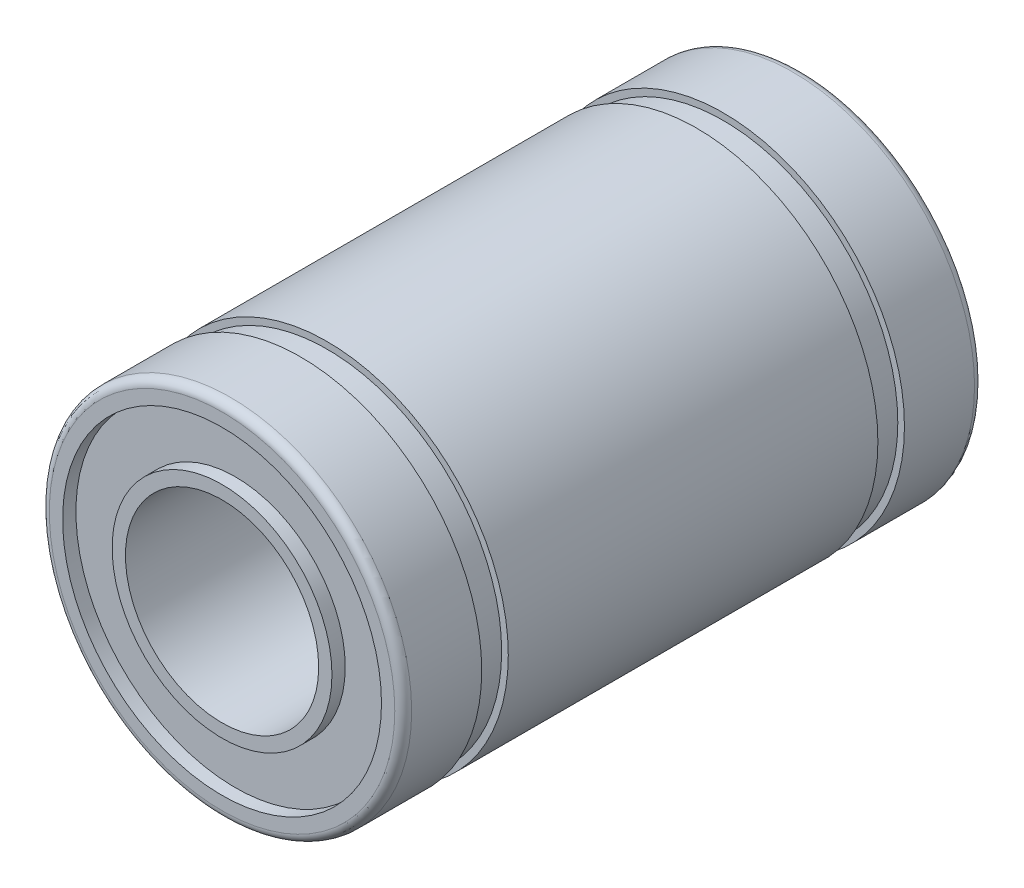
ISO-10303-21;
HEADER;
FILE_DESCRIPTION(('STEP AP214'),'2;1');
FILE_NAME('part.step','',(''),(''),'','','');
FILE_SCHEMA(('AUTOMOTIVE_DESIGN { 1 0 10303 214 1 1 1 1 }'));
ENDSEC;
DATA;
#1=APPLICATION_CONTEXT('core data for automotive mechanical design processes');
#2=APPLICATION_PROTOCOL_DEFINITION('international standard','automotive_design',2000,#1);
#3=PRODUCT_CONTEXT('',#1,'mechanical');
#4=PRODUCT('Part','Part','',(#3));
#5=PRODUCT_RELATED_PRODUCT_CATEGORY('part','',(#4));
#6=PRODUCT_DEFINITION_FORMATION('','',#4);
#7=PRODUCT_DEFINITION_CONTEXT('part definition',#1,'design');
#8=PRODUCT_DEFINITION('design','',#6,#7);
#9=PRODUCT_DEFINITION_SHAPE('','',#8);
#10=(LENGTH_UNIT() NAMED_UNIT(*) SI_UNIT(.MILLI.,.METRE.));
#11=(NAMED_UNIT(*) PLANE_ANGLE_UNIT() SI_UNIT($,.RADIAN.));
#12=(NAMED_UNIT(*) SI_UNIT($,.STERADIAN.) SOLID_ANGLE_UNIT());
#13=UNCERTAINTY_MEASURE_WITH_UNIT(LENGTH_MEASURE(1.E-05),#10,'distance_accuracy_value','');
#14=(GEOMETRIC_REPRESENTATION_CONTEXT(3) GLOBAL_UNCERTAINTY_ASSIGNED_CONTEXT((#13)) GLOBAL_UNIT_ASSIGNED_CONTEXT((#10,
#11,#12)) REPRESENTATION_CONTEXT('',''));
#15=CARTESIAN_POINT('',(0.,0.,0.));
#16=DIRECTION('',(0.,0.,1.));
#17=DIRECTION('',(1.,0.,0.));
#18=AXIS2_PLACEMENT_3D('',#15,#16,#17);
#19=CARTESIAN_POINT('',(0.,0.,24.));
#20=DIRECTION('',(0.,0.,1.));
#21=DIRECTION('',(0.,-1.,0.));
#22=AXIS2_PLACEMENT_3D('',#19,#20,#21);
#23=PLANE('',#22);
#24=CARTESIAN_POINT('',(0.,0.,24.));
#25=DIRECTION('',(0.,0.,1.));
#26=DIRECTION('',(1.,0.,0.));
#27=AXIS2_PLACEMENT_3D('',#24,#25,#26);
#28=CIRCLE('',#27,7.15);
#29=CARTESIAN_POINT('',(7.15,0.,24.));
#30=VERTEX_POINT('',#29);
#31=EDGE_CURVE('E11',#30,#30,#28,.T.);
#32=ORIENTED_EDGE('',*,*,#31,.F.);
#33=EDGE_LOOP('',(#32));
#34=FACE_BOUND('',#33,.T.);
#35=CARTESIAN_POINT('',(0.,0.,24.));
#36=DIRECTION('',(0.,0.,1.));
#37=DIRECTION('',(1.,0.,0.));
#38=AXIS2_PLACEMENT_3D('',#35,#36,#37);
#39=CIRCLE('',#38,7.151);
#40=CARTESIAN_POINT('',(7.151,0.,24.));
#41=VERTEX_POINT('',#40);
#42=EDGE_CURVE('E28',#41,#41,#39,.T.);
#43=ORIENTED_EDGE('',*,*,#42,.T.);
#44=EDGE_LOOP('',(#43));
#45=FACE_BOUND('',#44,.T.);
#46=ADVANCED_FACE('F17',(#34,#45),#23,.T.);
#47=CARTESIAN_POINT('',(0.,0.,24.));
#48=DIRECTION('',(0.,0.,1.));
#49=DIRECTION('',(0.,-1.,0.));
#50=AXIS2_PLACEMENT_3D('',#47,#48,#49);
#51=PLANE('',#50);
#52=CARTESIAN_POINT('',(0.,0.,24.));
#53=DIRECTION('',(0.,0.,1.));
#54=DIRECTION('',(1.,0.,0.));
#55=AXIS2_PLACEMENT_3D('',#52,#53,#54);
#56=CIRCLE('',#55,6.6);
#57=CARTESIAN_POINT('',(6.6,0.,24.));
#58=VERTEX_POINT('',#57);
#59=EDGE_CURVE('E155',#58,#58,#56,.T.);
#60=ORIENTED_EDGE('',*,*,#59,.F.);
#61=EDGE_LOOP('',(#60));
#62=FACE_BOUND('',#61,.T.);
#63=ORIENTED_EDGE('',*,*,#31,.T.);
#64=EDGE_LOOP('',(#63));
#65=FACE_BOUND('',#64,.T.);
#66=ADVANCED_FACE('F19',(#62,#65),#51,.T.);
#67=CARTESIAN_POINT('',(0.,0.,23.651));
#68=DIRECTION('',(0.,0.,-1.));
#69=DIRECTION('',(1.,0.,0.));
#70=AXIS2_PLACEMENT_3D('',#67,#68,#69);
#71=TOROIDAL_SURFACE('',#70,7.151,0.349);
#72=CARTESIAN_POINT('',(0.,0.,23.651));
#73=DIRECTION('',(0.,0.,1.));
#74=DIRECTION('',(1.,0.,0.));
#75=AXIS2_PLACEMENT_3D('',#72,#73,#74);
#76=CIRCLE('',#75,7.5);
#77=CARTESIAN_POINT('',(7.5,0.,23.651));
#78=VERTEX_POINT('',#77);
#79=EDGE_CURVE('E151',#78,#78,#76,.T.);
#80=ORIENTED_EDGE('',*,*,#79,.T.);
#81=CARTESIAN_POINT('',(7.151,0.,23.651));
#82=DIRECTION('',(0.,1.,0.));
#83=DIRECTION('',(1.,0.,0.));
#84=AXIS2_PLACEMENT_3D('',#81,#82,#83);
#85=CIRCLE('',#84,0.349);
#86=EDGE_CURVE('E197',#41,#78,#85,.T.);
#87=ORIENTED_EDGE('',*,*,#86,.F.);
#88=ORIENTED_EDGE('',*,*,#42,.F.);
#89=ORIENTED_EDGE('',*,*,#86,.T.);
#90=EDGE_LOOP('',(#80,#87,#88,#89));
#91=FACE_BOUND('',#90,.T.);
#92=ADVANCED_FACE('F304',(#91),#71,.T.);
#93=CARTESIAN_POINT('',(0.,0.,24.));
#94=DIRECTION('',(0.,0.,1.));
#95=DIRECTION('',(1.,0.,0.));
#96=AXIS2_PLACEMENT_3D('',#93,#94,#95);
#97=CYLINDRICAL_SURFACE('',#96,6.6);
#98=ORIENTED_EDGE('',*,*,#59,.T.);
#99=DIRECTION('',(0.,0.,-1.));
#100=VECTOR('',#99,1.);
#101=CARTESIAN_POINT('',(6.6,0.,24.));
#102=LINE('',#101,#100);
#103=CARTESIAN_POINT('',(6.6,0.,23.45));
#104=VERTEX_POINT('',#103);
#105=EDGE_CURVE('E141',#58,#104,#102,.T.);
#106=ORIENTED_EDGE('',*,*,#105,.T.);
#107=CARTESIAN_POINT('',(0.,0.,23.45));
#108=DIRECTION('',(0.,0.,1.));
#109=DIRECTION('',(1.,0.,0.));
#110=AXIS2_PLACEMENT_3D('',#107,#108,#109);
#111=CIRCLE('',#110,6.6);
#112=EDGE_CURVE('E235',#104,#104,#111,.T.);
#113=ORIENTED_EDGE('',*,*,#112,.F.);
#114=ORIENTED_EDGE('',*,*,#105,.F.);
#115=EDGE_LOOP('',(#98,#106,#113,#114));
#116=FACE_BOUND('',#115,.T.);
#117=ADVANCED_FACE('F313',(#116),#97,.F.);
#118=CARTESIAN_POINT('',(0.,0.,0.));
#119=DIRECTION('',(0.,0.,-1.));
#120=DIRECTION('',(1.,0.,0.));
#121=AXIS2_PLACEMENT_3D('',#118,#119,#120);
#122=CYLINDRICAL_SURFACE('',#121,7.5);
#123=DIRECTION('',(0.,0.,1.));
#124=VECTOR('',#123,1.);
#125=CARTESIAN_POINT('',(7.5,0.,0.));
#126=LINE('',#125,#124);
#127=CARTESIAN_POINT('',(7.5,0.,20.75));
#128=VERTEX_POINT('',#127);
#129=EDGE_CURVE('E156',#128,#78,#126,.T.);
#130=ORIENTED_EDGE('',*,*,#129,.T.);
#131=ORIENTED_EDGE('',*,*,#79,.F.);
#132=ORIENTED_EDGE('',*,*,#129,.F.);
#133=CARTESIAN_POINT('',(0.,0.,20.75));
#134=DIRECTION('',(0.,0.,1.));
#135=DIRECTION('',(1.,0.,0.));
#136=AXIS2_PLACEMENT_3D('',#133,#134,#135);
#137=CIRCLE('',#136,7.5);
#138=EDGE_CURVE('E236',#128,#128,#137,.T.);
#139=ORIENTED_EDGE('',*,*,#138,.T.);
#140=EDGE_LOOP('',(#130,#131,#132,#139));
#141=FACE_BOUND('',#140,.T.);
#142=ADVANCED_FACE('F315',(#141),#122,.T.);
#143=CARTESIAN_POINT('',(0.,0.,23.45));
#144=DIRECTION('',(0.,0.,1.));
#145=DIRECTION('',(0.,-1.,0.));
#146=AXIS2_PLACEMENT_3D('',#143,#144,#145);
#147=PLANE('',#146);
#148=CARTESIAN_POINT('',(0.,0.,23.45));
#149=DIRECTION('',(0.,0.,1.));
#150=DIRECTION('',(1.,0.,0.));
#151=AXIS2_PLACEMENT_3D('',#148,#149,#150);
#152=CIRCLE('',#151,4.55);
#153=CARTESIAN_POINT('',(4.55,0.,23.45));
#154=VERTEX_POINT('',#153);
#155=EDGE_CURVE('E161',#154,#154,#152,.T.);
#156=ORIENTED_EDGE('',*,*,#155,.F.);
#157=EDGE_LOOP('',(#156));
#158=FACE_BOUND('',#157,.T.);
#159=ORIENTED_EDGE('',*,*,#112,.T.);
#160=EDGE_LOOP('',(#159));
#161=FACE_BOUND('',#160,.T.);
#162=ADVANCED_FACE('F320',(#158,#161),#147,.T.);
#163=CARTESIAN_POINT('',(0.,0.,20.75));
#164=DIRECTION('',(0.,0.,1.));
#165=DIRECTION('',(0.,-1.,0.));
#166=AXIS2_PLACEMENT_3D('',#163,#164,#165);
#167=PLANE('',#166);
#168=CARTESIAN_POINT('',(0.,0.,20.75));
#169=DIRECTION('',(0.,0.,1.));
#170=DIRECTION('',(1.,0.,0.));
#171=AXIS2_PLACEMENT_3D('',#168,#169,#170);
#172=CIRCLE('',#171,7.225);
#173=CARTESIAN_POINT('',(7.225,0.,20.75));
#174=VERTEX_POINT('',#173);
#175=EDGE_CURVE('E162',#174,#174,#172,.T.);
#176=ORIENTED_EDGE('',*,*,#175,.T.);
#177=EDGE_LOOP('',(#176));
#178=FACE_BOUND('',#177,.T.);
#179=ORIENTED_EDGE('',*,*,#138,.F.);
#180=EDGE_LOOP('',(#179));
#181=FACE_BOUND('',#180,.T.);
#182=ADVANCED_FACE('F355',(#178,#181),#167,.F.);
#183=CARTESIAN_POINT('',(0.,0.,24.));
#184=DIRECTION('',(0.,0.,1.));
#185=DIRECTION('',(1.,0.,0.));
#186=AXIS2_PLACEMENT_3D('',#183,#184,#185);
#187=CYLINDRICAL_SURFACE('',#186,4.55);
#188=DIRECTION('',(0.,0.,-1.));
#189=VECTOR('',#188,1.);
#190=CARTESIAN_POINT('',(4.55,0.,24.));
#191=LINE('',#190,#189);
#192=CARTESIAN_POINT('',(4.55,0.,24.));
#193=VERTEX_POINT('',#192);
#194=EDGE_CURVE('E157',#193,#154,#191,.T.);
#195=ORIENTED_EDGE('',*,*,#194,.T.);
#196=ORIENTED_EDGE('',*,*,#155,.T.);
#197=ORIENTED_EDGE('',*,*,#194,.F.);
#198=CARTESIAN_POINT('',(0.,0.,24.));
#199=DIRECTION('',(0.,0.,1.));
#200=DIRECTION('',(1.,0.,0.));
#201=AXIS2_PLACEMENT_3D('',#198,#199,#200);
#202=CIRCLE('',#201,4.55);
#203=EDGE_CURVE('E178',#193,#193,#202,.T.);
#204=ORIENTED_EDGE('',*,*,#203,.F.);
#205=EDGE_LOOP('',(#195,#196,#197,#204));
#206=FACE_BOUND('',#205,.T.);
#207=ADVANCED_FACE('F311',(#206),#187,.T.);
#208=CARTESIAN_POINT('',(0.,0.,20.75));
#209=DIRECTION('',(0.,0.,1.));
#210=DIRECTION('',(1.,0.,0.));
#211=AXIS2_PLACEMENT_3D('',#208,#209,#210);
#212=CYLINDRICAL_SURFACE('',#211,7.225);
#213=DIRECTION('',(0.,0.,-1.));
#214=VECTOR('',#213,1.);
#215=CARTESIAN_POINT('',(7.225,0.,20.75));
#216=LINE('',#215,#214);
#217=CARTESIAN_POINT('',(7.225,0.,19.65));
#218=VERTEX_POINT('',#217);
#219=EDGE_CURVE('E222',#174,#218,#216,.T.);
#220=ORIENTED_EDGE('',*,*,#219,.T.);
#221=CARTESIAN_POINT('',(0.,0.,19.65));
#222=DIRECTION('',(0.,0.,1.));
#223=DIRECTION('',(1.,0.,0.));
#224=AXIS2_PLACEMENT_3D('',#221,#222,#223);
#225=CIRCLE('',#224,7.225);
#226=EDGE_CURVE('E174',#218,#218,#225,.T.);
#227=ORIENTED_EDGE('',*,*,#226,.T.);
#228=ORIENTED_EDGE('',*,*,#219,.F.);
#229=ORIENTED_EDGE('',*,*,#175,.F.);
#230=EDGE_LOOP('',(#220,#227,#228,#229));
#231=FACE_BOUND('',#230,.T.);
#232=ADVANCED_FACE('F292',(#231),#212,.T.);
#233=CARTESIAN_POINT('',(0.,0.,24.));
#234=DIRECTION('',(0.,0.,1.));
#235=DIRECTION('',(0.,-1.,0.));
#236=AXIS2_PLACEMENT_3D('',#233,#234,#235);
#237=PLANE('',#236);
#238=CARTESIAN_POINT('',(0.,0.,24.));
#239=DIRECTION('',(0.,0.,1.));
#240=DIRECTION('',(1.,0.,0.));
#241=AXIS2_PLACEMENT_3D('',#238,#239,#240);
#242=CIRCLE('',#241,4.);
#243=CARTESIAN_POINT('',(4.,0.,24.));
#244=VERTEX_POINT('',#243);
#245=EDGE_CURVE('E21',#244,#244,#242,.T.);
#246=ORIENTED_EDGE('',*,*,#245,.F.);
#247=EDGE_LOOP('',(#246));
#248=FACE_BOUND('',#247,.T.);
#249=ORIENTED_EDGE('',*,*,#203,.T.);
#250=EDGE_LOOP('',(#249));
#251=FACE_BOUND('',#250,.T.);
#252=ADVANCED_FACE('F282',(#248,#251),#237,.T.);
#253=CARTESIAN_POINT('',(0.,0.,19.65));
#254=DIRECTION('',(0.,0.,1.));
#255=DIRECTION('',(0.,-1.,0.));
#256=AXIS2_PLACEMENT_3D('',#253,#254,#255);
#257=PLANE('',#256);
#258=ORIENTED_EDGE('',*,*,#226,.F.);
#259=EDGE_LOOP('',(#258));
#260=FACE_BOUND('',#259,.T.);
#261=CARTESIAN_POINT('',(0.,0.,19.65));
#262=DIRECTION('',(0.,0.,1.));
#263=DIRECTION('',(1.,0.,0.));
#264=AXIS2_PLACEMENT_3D('',#261,#262,#263);
#265=CIRCLE('',#264,7.5);
#266=CARTESIAN_POINT('',(7.5,0.,19.65));
#267=VERTEX_POINT('',#266);
#268=EDGE_CURVE('E149',#267,#267,#265,.T.);
#269=ORIENTED_EDGE('',*,*,#268,.T.);
#270=EDGE_LOOP('',(#269));
#271=FACE_BOUND('',#270,.T.);
#272=ADVANCED_FACE('F279',(#260,#271),#257,.T.);
#273=CARTESIAN_POINT('',(0.,0.,0.));
#274=DIRECTION('',(0.,0.,-1.));
#275=DIRECTION('',(1.,0.,0.));
#276=AXIS2_PLACEMENT_3D('',#273,#274,#275);
#277=CYLINDRICAL_SURFACE('',#276,4.);
#278=DIRECTION('',(0.,0.,1.));
#279=VECTOR('',#278,1.);
#280=CARTESIAN_POINT('',(4.,0.,0.));
#281=LINE('',#280,#279);
#282=CARTESIAN_POINT('',(4.,0.,0.));
#283=VERTEX_POINT('',#282);
#284=EDGE_CURVE('E190',#283,#244,#281,.T.);
#285=ORIENTED_EDGE('',*,*,#284,.T.);
#286=ORIENTED_EDGE('',*,*,#245,.T.);
#287=ORIENTED_EDGE('',*,*,#284,.F.);
#288=CARTESIAN_POINT('',(0.,0.,0.));
#289=DIRECTION('',(0.,0.,1.));
#290=DIRECTION('',(1.,0.,0.));
#291=AXIS2_PLACEMENT_3D('',#288,#289,#290);
#292=CIRCLE('',#291,4.);
#293=EDGE_CURVE('E145',#283,#283,#292,.T.);
#294=ORIENTED_EDGE('',*,*,#293,.F.);
#295=EDGE_LOOP('',(#285,#286,#287,#294));
#296=FACE_BOUND('',#295,.T.);
#297=ADVANCED_FACE('F281',(#296),#277,.F.);
#298=CARTESIAN_POINT('',(0.,0.,0.));
#299=DIRECTION('',(0.,0.,-1.));
#300=DIRECTION('',(1.,0.,0.));
#301=AXIS2_PLACEMENT_3D('',#298,#299,#300);
#302=CYLINDRICAL_SURFACE('',#301,7.5);
#303=ORIENTED_EDGE('',*,*,#268,.F.);
#304=DIRECTION('',(0.,0.,1.));
#305=VECTOR('',#304,1.);
#306=CARTESIAN_POINT('',(7.5,0.,0.));
#307=LINE('',#306,#305);
#308=CARTESIAN_POINT('',(7.5,0.,4.35));
#309=VERTEX_POINT('',#308);
#310=EDGE_CURVE('E187',#309,#267,#307,.T.);
#311=ORIENTED_EDGE('',*,*,#310,.F.);
#312=CARTESIAN_POINT('',(0.,0.,4.35));
#313=DIRECTION('',(0.,0.,-1.));
#314=DIRECTION('',(1.,0.,0.));
#315=AXIS2_PLACEMENT_3D('',#312,#313,#314);
#316=CIRCLE('',#315,7.5);
#317=EDGE_CURVE('E150',#309,#309,#316,.T.);
#318=ORIENTED_EDGE('',*,*,#317,.F.);
#319=ORIENTED_EDGE('',*,*,#310,.T.);
#320=EDGE_LOOP('',(#303,#311,#318,#319));
#321=FACE_BOUND('',#320,.T.);
#322=ADVANCED_FACE('F277',(#321),#302,.T.);
#323=CARTESIAN_POINT('',(0.,0.,0.));
#324=DIRECTION('',(0.,0.,1.));
#325=DIRECTION('',(0.,-1.,0.));
#326=AXIS2_PLACEMENT_3D('',#323,#324,#325);
#327=PLANE('',#326);
#328=ORIENTED_EDGE('',*,*,#293,.T.);
#329=EDGE_LOOP('',(#328));
#330=FACE_BOUND('',#329,.T.);
#331=CARTESIAN_POINT('',(0.,0.,0.));
#332=DIRECTION('',(0.,0.,1.));
#333=DIRECTION('',(1.,0.,0.));
#334=AXIS2_PLACEMENT_3D('',#331,#332,#333);
#335=CIRCLE('',#334,4.55);
#336=CARTESIAN_POINT('',(4.55,0.,0.));
#337=VERTEX_POINT('',#336);
#338=EDGE_CURVE('E179',#337,#337,#335,.T.);
#339=ORIENTED_EDGE('',*,*,#338,.F.);
#340=EDGE_LOOP('',(#339));
#341=FACE_BOUND('',#340,.T.);
#342=ADVANCED_FACE('F272',(#330,#341),#327,.F.);
#343=CARTESIAN_POINT('',(0.,0.,4.35));
#344=DIRECTION('',(0.,0.,-1.));
#345=DIRECTION('',(0.,-1.,0.));
#346=AXIS2_PLACEMENT_3D('',#343,#344,#345);
#347=PLANE('',#346);
#348=CARTESIAN_POINT('',(0.,0.,4.35));
#349=DIRECTION('',(0.,0.,-1.));
#350=DIRECTION('',(1.,0.,0.));
#351=AXIS2_PLACEMENT_3D('',#348,#349,#350);
#352=CIRCLE('',#351,7.225);
#353=CARTESIAN_POINT('',(7.225,0.,4.35));
#354=VERTEX_POINT('',#353);
#355=EDGE_CURVE('E167',#354,#354,#352,.T.);
#356=ORIENTED_EDGE('',*,*,#355,.F.);
#357=EDGE_LOOP('',(#356));
#358=FACE_BOUND('',#357,.T.);
#359=ORIENTED_EDGE('',*,*,#317,.T.);
#360=EDGE_LOOP('',(#359));
#361=FACE_BOUND('',#360,.T.);
#362=ADVANCED_FACE('F268',(#358,#361),#347,.T.);
#363=CARTESIAN_POINT('',(0.,0.,0.));
#364=DIRECTION('',(0.,0.,-1.));
#365=DIRECTION('',(1.,0.,0.));
#366=AXIS2_PLACEMENT_3D('',#363,#364,#365);
#367=CYLINDRICAL_SURFACE('',#366,4.55);
#368=ORIENTED_EDGE('',*,*,#338,.T.);
#369=DIRECTION('',(0.,0.,1.));
#370=VECTOR('',#369,1.);
#371=CARTESIAN_POINT('',(4.55,0.,0.));
#372=LINE('',#371,#370);
#373=CARTESIAN_POINT('',(4.55,0.,0.55));
#374=VERTEX_POINT('',#373);
#375=EDGE_CURVE('E183',#337,#374,#372,.T.);
#376=ORIENTED_EDGE('',*,*,#375,.T.);
#377=CARTESIAN_POINT('',(0.,0.,0.55));
#378=DIRECTION('',(0.,0.,1.));
#379=DIRECTION('',(1.,0.,0.));
#380=AXIS2_PLACEMENT_3D('',#377,#378,#379);
#381=CIRCLE('',#380,4.55);
#382=EDGE_CURVE('E168',#374,#374,#381,.T.);
#383=ORIENTED_EDGE('',*,*,#382,.F.);
#384=ORIENTED_EDGE('',*,*,#375,.F.);
#385=EDGE_LOOP('',(#368,#376,#383,#384));
#386=FACE_BOUND('',#385,.T.);
#387=ADVANCED_FACE('F271',(#386),#367,.T.);
#388=CARTESIAN_POINT('',(0.,0.,3.25));
#389=DIRECTION('',(0.,0.,-1.));
#390=DIRECTION('',(1.,0.,0.));
#391=AXIS2_PLACEMENT_3D('',#388,#389,#390);
#392=CYLINDRICAL_SURFACE('',#391,7.225);
#393=DIRECTION('',(0.,0.,1.));
#394=VECTOR('',#393,1.);
#395=CARTESIAN_POINT('',(7.225,0.,3.25));
#396=LINE('',#395,#394);
#397=CARTESIAN_POINT('',(7.225,0.,3.25));
#398=VERTEX_POINT('',#397);
#399=EDGE_CURVE('E163',#398,#354,#396,.T.);
#400=ORIENTED_EDGE('',*,*,#399,.T.);
#401=ORIENTED_EDGE('',*,*,#355,.T.);
#402=ORIENTED_EDGE('',*,*,#399,.F.);
#403=CARTESIAN_POINT('',(0.,0.,3.25));
#404=DIRECTION('',(0.,0.,-1.));
#405=DIRECTION('',(1.,0.,0.));
#406=AXIS2_PLACEMENT_3D('',#403,#404,#405);
#407=CIRCLE('',#406,7.225);
#408=EDGE_CURVE('E218',#398,#398,#407,.T.);
#409=ORIENTED_EDGE('',*,*,#408,.F.);
#410=EDGE_LOOP('',(#400,#401,#402,#409));
#411=FACE_BOUND('',#410,.T.);
#412=ADVANCED_FACE('F265',(#411),#392,.T.);
#413=CARTESIAN_POINT('',(0.,0.,0.55));
#414=DIRECTION('',(0.,0.,1.));
#415=DIRECTION('',(1.,0.,0.));
#416=AXIS2_PLACEMENT_3D('',#413,#414,#415);
#417=PLANE('',#416);
#418=ORIENTED_EDGE('',*,*,#382,.T.);
#419=EDGE_LOOP('',(#418));
#420=FACE_BOUND('',#419,.T.);
#421=CARTESIAN_POINT('',(0.,0.,0.55));
#422=DIRECTION('',(0.,0.,1.));
#423=DIRECTION('',(1.,0.,0.));
#424=AXIS2_PLACEMENT_3D('',#421,#422,#423);
#425=CIRCLE('',#424,6.6);
#426=CARTESIAN_POINT('',(6.6,0.,0.55));
#427=VERTEX_POINT('',#426);
#428=EDGE_CURVE('E121',#427,#427,#425,.T.);
#429=ORIENTED_EDGE('',*,*,#428,.F.);
#430=EDGE_LOOP('',(#429));
#431=FACE_BOUND('',#430,.T.);
#432=ADVANCED_FACE('F332',(#420,#431),#417,.F.);
#433=CARTESIAN_POINT('',(0.,0.,3.25));
#434=DIRECTION('',(0.,0.,-1.));
#435=DIRECTION('',(0.,-1.,0.));
#436=AXIS2_PLACEMENT_3D('',#433,#434,#435);
#437=PLANE('',#436);
#438=ORIENTED_EDGE('',*,*,#408,.T.);
#439=EDGE_LOOP('',(#438));
#440=FACE_BOUND('',#439,.T.);
#441=CARTESIAN_POINT('',(0.,0.,3.25));
#442=DIRECTION('',(0.,0.,-1.));
#443=DIRECTION('',(1.,0.,0.));
#444=AXIS2_PLACEMENT_3D('',#441,#442,#443);
#445=CIRCLE('',#444,7.5);
#446=CARTESIAN_POINT('',(7.5,0.,3.25));
#447=VERTEX_POINT('',#446);
#448=EDGE_CURVE('E123',#447,#447,#445,.T.);
#449=ORIENTED_EDGE('',*,*,#448,.F.);
#450=EDGE_LOOP('',(#449));
#451=FACE_BOUND('',#450,.T.);
#452=ADVANCED_FACE('F330',(#440,#451),#437,.F.);
#453=CARTESIAN_POINT('',(0.,0.,0.));
#454=DIRECTION('',(0.,0.,-1.));
#455=DIRECTION('',(1.,0.,0.));
#456=AXIS2_PLACEMENT_3D('',#453,#454,#455);
#457=CYLINDRICAL_SURFACE('',#456,6.6);
#458=DIRECTION('',(0.,0.,1.));
#459=VECTOR('',#458,1.);
#460=CARTESIAN_POINT('',(6.6,0.,0.));
#461=LINE('',#460,#459);
#462=CARTESIAN_POINT('',(6.6,0.,0.));
#463=VERTEX_POINT('',#462);
#464=EDGE_CURVE('E116',#463,#427,#461,.T.);
#465=ORIENTED_EDGE('',*,*,#464,.T.);
#466=ORIENTED_EDGE('',*,*,#428,.T.);
#467=ORIENTED_EDGE('',*,*,#464,.F.);
#468=CARTESIAN_POINT('',(0.,0.,0.));
#469=DIRECTION('',(0.,0.,1.));
#470=DIRECTION('',(1.,0.,0.));
#471=AXIS2_PLACEMENT_3D('',#468,#469,#470);
#472=CIRCLE('',#471,6.6);
#473=EDGE_CURVE('E119',#463,#463,#472,.T.);
#474=ORIENTED_EDGE('',*,*,#473,.F.);
#475=EDGE_LOOP('',(#465,#466,#467,#474));
#476=FACE_BOUND('',#475,.T.);
#477=ADVANCED_FACE('F118',(#476),#457,.F.);
#478=CARTESIAN_POINT('',(0.,0.,0.));
#479=DIRECTION('',(0.,0.,-1.));
#480=DIRECTION('',(1.,0.,0.));
#481=AXIS2_PLACEMENT_3D('',#478,#479,#480);
#482=CYLINDRICAL_SURFACE('',#481,7.5);
#483=DIRECTION('',(0.,0.,1.));
#484=VECTOR('',#483,1.);
#485=CARTESIAN_POINT('',(7.5,0.,0.));
#486=LINE('',#485,#484);
#487=CARTESIAN_POINT('',(7.5,0.,0.349));
#488=VERTEX_POINT('',#487);
#489=EDGE_CURVE('E129',#488,#447,#486,.T.);
#490=ORIENTED_EDGE('',*,*,#489,.T.);
#491=ORIENTED_EDGE('',*,*,#448,.T.);
#492=ORIENTED_EDGE('',*,*,#489,.F.);
#493=CARTESIAN_POINT('',(0.,0.,0.349));
#494=DIRECTION('',(0.,0.,1.));
#495=DIRECTION('',(1.,0.,0.));
#496=AXIS2_PLACEMENT_3D('',#493,#494,#495);
#497=CIRCLE('',#496,7.5);
#498=EDGE_CURVE('E130',#488,#488,#497,.T.);
#499=ORIENTED_EDGE('',*,*,#498,.T.);
#500=EDGE_LOOP('',(#490,#491,#492,#499));
#501=FACE_BOUND('',#500,.T.);
#502=ADVANCED_FACE('F329',(#501),#482,.T.);
#503=CARTESIAN_POINT('',(0.,0.,0.));
#504=DIRECTION('',(0.,0.,1.));
#505=DIRECTION('',(0.,-1.,0.));
#506=AXIS2_PLACEMENT_3D('',#503,#504,#505);
#507=PLANE('',#506);
#508=ORIENTED_EDGE('',*,*,#473,.T.);
#509=EDGE_LOOP('',(#508));
#510=FACE_BOUND('',#509,.T.);
#511=CARTESIAN_POINT('',(0.,0.,0.));
#512=DIRECTION('',(0.,0.,1.));
#513=DIRECTION('',(1.,0.,0.));
#514=AXIS2_PLACEMENT_3D('',#511,#512,#513);
#515=CIRCLE('',#514,7.15);
#516=CARTESIAN_POINT('',(7.15,0.,0.));
#517=VERTEX_POINT('',#516);
#518=EDGE_CURVE('E173',#517,#517,#515,.T.);
#519=ORIENTED_EDGE('',*,*,#518,.F.);
#520=EDGE_LOOP('',(#519));
#521=FACE_BOUND('',#520,.T.);
#522=ADVANCED_FACE('F126',(#510,#521),#507,.F.);
#523=CARTESIAN_POINT('',(0.,0.,0.349));
#524=DIRECTION('',(0.,0.,1.));
#525=DIRECTION('',(1.,0.,0.));
#526=AXIS2_PLACEMENT_3D('',#523,#524,#525);
#527=TOROIDAL_SURFACE('',#526,7.151,0.349);
#528=CARTESIAN_POINT('',(7.151,0.,0.349));
#529=DIRECTION('',(0.,-1.,0.));
#530=DIRECTION('',(1.,0.,0.));
#531=AXIS2_PLACEMENT_3D('',#528,#529,#530);
#532=CIRCLE('',#531,0.349);
#533=CARTESIAN_POINT('',(7.151,0.,0.));
#534=VERTEX_POINT('',#533);
#535=EDGE_CURVE('E139',#534,#488,#532,.T.);
#536=ORIENTED_EDGE('',*,*,#535,.F.);
#537=CARTESIAN_POINT('',(0.,0.,0.));
#538=DIRECTION('',(0.,0.,1.));
#539=DIRECTION('',(1.,0.,0.));
#540=AXIS2_PLACEMENT_3D('',#537,#538,#539);
#541=CIRCLE('',#540,7.151);
#542=EDGE_CURVE('E169',#534,#534,#541,.T.);
#543=ORIENTED_EDGE('',*,*,#542,.T.);
#544=ORIENTED_EDGE('',*,*,#535,.T.);
#545=ORIENTED_EDGE('',*,*,#498,.F.);
#546=EDGE_LOOP('',(#536,#543,#544,#545));
#547=FACE_BOUND('',#546,.T.);
#548=ADVANCED_FACE('F328',(#547),#527,.T.);
#549=CARTESIAN_POINT('',(0.,0.,0.));
#550=DIRECTION('',(0.,0.,1.));
#551=DIRECTION('',(0.,-1.,0.));
#552=AXIS2_PLACEMENT_3D('',#549,#550,#551);
#553=PLANE('',#552);
#554=ORIENTED_EDGE('',*,*,#518,.T.);
#555=EDGE_LOOP('',(#554));
#556=FACE_BOUND('',#555,.T.);
#557=ORIENTED_EDGE('',*,*,#542,.F.);
#558=EDGE_LOOP('',(#557));
#559=FACE_BOUND('',#558,.T.);
#560=ADVANCED_FACE('F335',(#556,#559),#553,.F.);
#561=CLOSED_SHELL('',(#46,#66,#92,#117,#142,#162,#182,#207,#232,#252,#272,#297,#322,#342,#362,
#387,#412,#432,#452,#477,#502,#522,#548,#560));
#562=MANIFOLD_SOLID_BREP('B1',#561);
#563=ADVANCED_BREP_SHAPE_REPRESENTATION('',(#18,#562),#14);
#564=SHAPE_DEFINITION_REPRESENTATION(#9,#563);
ENDSEC;
END-ISO-10303-21;
